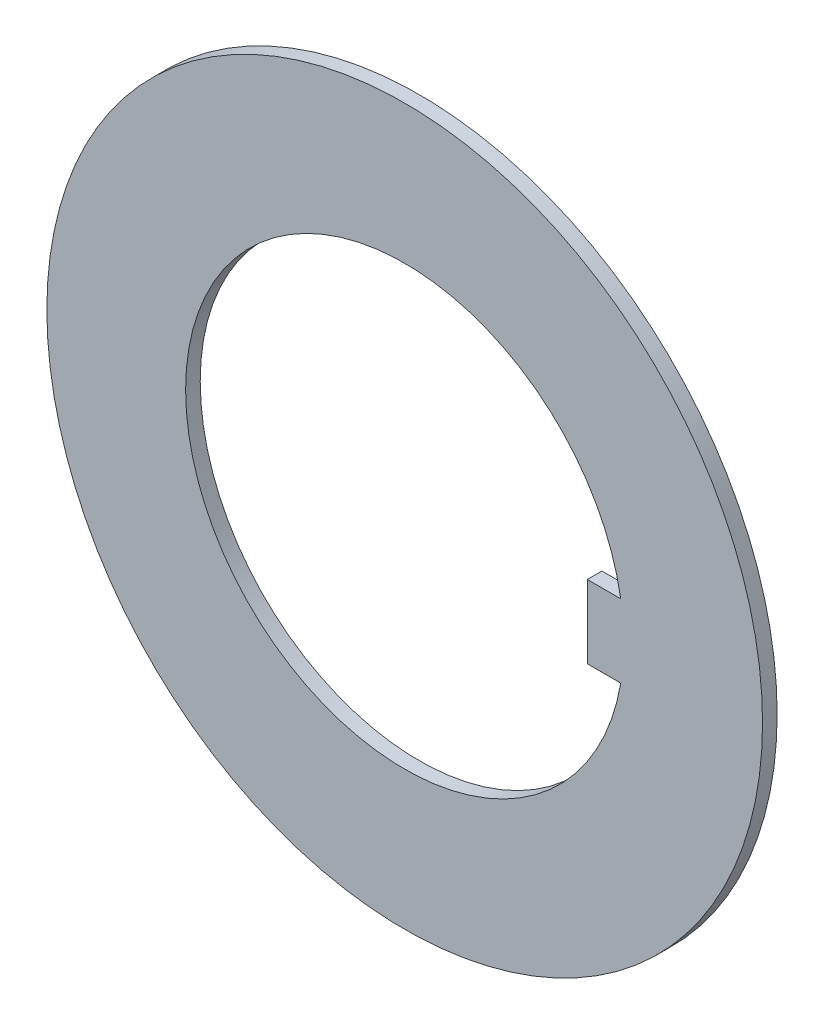
ISO-10303-21;
HEADER;
FILE_DESCRIPTION(('STEP AP214'),'2;1');
FILE_NAME('part.step','',(''),(''),'','','');
FILE_SCHEMA(('AUTOMOTIVE_DESIGN { 1 0 10303 214 1 1 1 1 }'));
ENDSEC;
DATA;
#1=APPLICATION_CONTEXT('core data for automotive mechanical design processes');
#2=APPLICATION_PROTOCOL_DEFINITION('international standard','automotive_design',2000,#1);
#3=PRODUCT_CONTEXT('',#1,'mechanical');
#4=PRODUCT('Part','Part','',(#3));
#5=PRODUCT_RELATED_PRODUCT_CATEGORY('part','',(#4));
#6=PRODUCT_DEFINITION_FORMATION('','',#4);
#7=PRODUCT_DEFINITION_CONTEXT('part definition',#1,'design');
#8=PRODUCT_DEFINITION('design','',#6,#7);
#9=PRODUCT_DEFINITION_SHAPE('','',#8);
#10=(LENGTH_UNIT() NAMED_UNIT(*) SI_UNIT(.MILLI.,.METRE.));
#11=(NAMED_UNIT(*) PLANE_ANGLE_UNIT() SI_UNIT($,.RADIAN.));
#12=(NAMED_UNIT(*) SI_UNIT($,.STERADIAN.) SOLID_ANGLE_UNIT());
#13=UNCERTAINTY_MEASURE_WITH_UNIT(LENGTH_MEASURE(1.E-05),#10,'distance_accuracy_value','');
#14=(GEOMETRIC_REPRESENTATION_CONTEXT(3) GLOBAL_UNCERTAINTY_ASSIGNED_CONTEXT((#13)) GLOBAL_UNIT_ASSIGNED_CONTEXT((#10,
#11,#12)) REPRESENTATION_CONTEXT('',''));
#15=CARTESIAN_POINT('',(0.,0.,0.));
#16=DIRECTION('',(0.,0.,1.));
#17=DIRECTION('',(1.,0.,0.));
#18=AXIS2_PLACEMENT_3D('',#15,#16,#17);
#19=CARTESIAN_POINT('',(0.,0.,150.));
#20=DIRECTION('',(0.,0.,1.));
#21=DIRECTION('',(1.,0.,0.));
#22=AXIS2_PLACEMENT_3D('',#19,#20,#21);
#23=CYLINDRICAL_SURFACE('',#22,15.);
#24=CARTESIAN_POINT('',(0.,0.,-89.));
#25=DIRECTION('',(0.,0.,1.));
#26=DIRECTION('',(1.,0.,0.));
#27=AXIS2_PLACEMENT_3D('',#24,#25,#26);
#28=CIRCLE('',#27,15.);
#29=CARTESIAN_POINT('',(14.790199457749,2.5,-89.));
#30=VERTEX_POINT('',#29);
#31=CARTESIAN_POINT('',(14.790199457749,-2.5,-89.));
#32=VERTEX_POINT('',#31);
#33=EDGE_CURVE('E117',#30,#32,#28,.T.);
#34=ORIENTED_EDGE('',*,*,#33,.F.);
#35=DIRECTION('',(0.,0.,1.));
#36=VECTOR('',#35,1.);
#37=CARTESIAN_POINT('',(14.790199457749,2.5,150.));
#38=LINE('',#37,#36);
#39=CARTESIAN_POINT('',(14.790199457749,2.5,-88.));
#40=VERTEX_POINT('',#39);
#41=EDGE_CURVE('E54',#30,#40,#38,.T.);
#42=ORIENTED_EDGE('',*,*,#41,.T.);
#43=CARTESIAN_POINT('',(0.,0.,-88.));
#44=DIRECTION('',(0.,0.,1.));
#45=DIRECTION('',(1.,0.,0.));
#46=AXIS2_PLACEMENT_3D('',#43,#44,#45);
#47=CIRCLE('',#46,15.);
#48=CARTESIAN_POINT('',(14.790199457749,-2.5,-88.));
#49=VERTEX_POINT('',#48);
#50=EDGE_CURVE('E11',#40,#49,#47,.T.);
#51=ORIENTED_EDGE('',*,*,#50,.T.);
#52=DIRECTION('',(0.,0.,1.));
#53=VECTOR('',#52,1.);
#54=CARTESIAN_POINT('',(14.790199457749,-2.5,150.));
#55=LINE('',#54,#53);
#56=EDGE_CURVE('E58',#32,#49,#55,.T.);
#57=ORIENTED_EDGE('',*,*,#56,.F.);
#58=EDGE_LOOP('',(#34,#42,#51,#57));
#59=FACE_BOUND('',#58,.T.);
#60=ADVANCED_FACE('F41',(#59),#23,.F.);
#61=CARTESIAN_POINT('',(15.,0.,-88.));
#62=DIRECTION('',(0.,0.,1.));
#63=DIRECTION('',(1.,0.,0.));
#64=AXIS2_PLACEMENT_3D('',#61,#62,#63);
#65=PLANE('',#64);
#66=ORIENTED_EDGE('',*,*,#50,.F.);
#67=DIRECTION('',(1.,0.,0.));
#68=VECTOR('',#67,1.);
#69=CARTESIAN_POINT('',(12.5,2.5,-88.));
#70=LINE('',#69,#68);
#71=CARTESIAN_POINT('',(12.5,2.5,-88.));
#72=VERTEX_POINT('',#71);
#73=EDGE_CURVE('E80',#72,#40,#70,.T.);
#74=ORIENTED_EDGE('',*,*,#73,.F.);
#75=DIRECTION('',(0.,-1.,0.));
#76=VECTOR('',#75,1.);
#77=CARTESIAN_POINT('',(12.5,2.5,-88.));
#78=LINE('',#77,#76);
#79=CARTESIAN_POINT('',(12.5,-2.5,-88.));
#80=VERTEX_POINT('',#79);
#81=EDGE_CURVE('E88',#72,#80,#78,.T.);
#82=ORIENTED_EDGE('',*,*,#81,.T.);
#83=DIRECTION('',(1.,0.,0.));
#84=VECTOR('',#83,1.);
#85=CARTESIAN_POINT('',(12.5,-2.5,-88.));
#86=LINE('',#85,#84);
#87=EDGE_CURVE('E154',#80,#49,#86,.T.);
#88=ORIENTED_EDGE('',*,*,#87,.T.);
#89=EDGE_LOOP('',(#66,#74,#82,#88));
#90=FACE_BOUND('',#89,.T.);
#91=CARTESIAN_POINT('',(0.,0.,-88.));
#92=DIRECTION('',(0.,0.,1.));
#93=DIRECTION('',(1.,0.,0.));
#94=AXIS2_PLACEMENT_3D('',#91,#92,#93);
#95=CIRCLE('',#94,24.5);
#96=CARTESIAN_POINT('',(24.5,0.,-88.));
#97=VERTEX_POINT('',#96);
#98=EDGE_CURVE('E47',#97,#97,#95,.T.);
#99=ORIENTED_EDGE('',*,*,#98,.T.);
#100=EDGE_LOOP('',(#99));
#101=FACE_BOUND('',#100,.T.);
#102=ADVANCED_FACE('F85',(#90,#101),#65,.T.);
#103=CARTESIAN_POINT('',(0.,0.,150.));
#104=DIRECTION('',(0.,0.,1.));
#105=DIRECTION('',(1.,0.,0.));
#106=AXIS2_PLACEMENT_3D('',#103,#104,#105);
#107=CYLINDRICAL_SURFACE('',#106,24.5);
#108=CARTESIAN_POINT('',(0.,0.,-89.));
#109=DIRECTION('',(0.,0.,1.));
#110=DIRECTION('',(1.,0.,0.));
#111=AXIS2_PLACEMENT_3D('',#108,#109,#110);
#112=CIRCLE('',#111,24.5);
#113=CARTESIAN_POINT('',(24.5,0.,-89.));
#114=VERTEX_POINT('',#113);
#115=EDGE_CURVE('E120',#114,#114,#112,.T.);
#116=ORIENTED_EDGE('',*,*,#115,.T.);
#117=EDGE_LOOP('',(#116));
#118=FACE_BOUND('',#117,.T.);
#119=ORIENTED_EDGE('',*,*,#98,.F.);
#120=EDGE_LOOP('',(#119));
#121=FACE_BOUND('',#120,.T.);
#122=ADVANCED_FACE('F126',(#118,#121),#107,.T.);
#123=CARTESIAN_POINT('',(24.5,0.,-89.));
#124=DIRECTION('',(0.,0.,-1.));
#125=DIRECTION('',(-1.,0.,0.));
#126=AXIS2_PLACEMENT_3D('',#123,#124,#125);
#127=PLANE('',#126);
#128=ORIENTED_EDGE('',*,*,#33,.T.);
#129=DIRECTION('',(-1.,0.,0.));
#130=VECTOR('',#129,1.);
#131=CARTESIAN_POINT('',(12.5,-2.5,-89.));
#132=LINE('',#131,#130);
#133=CARTESIAN_POINT('',(12.5,-2.5,-89.));
#134=VERTEX_POINT('',#133);
#135=EDGE_CURVE('E99',#32,#134,#132,.T.);
#136=ORIENTED_EDGE('',*,*,#135,.T.);
#137=DIRECTION('',(0.,-1.,0.));
#138=VECTOR('',#137,1.);
#139=CARTESIAN_POINT('',(12.5,2.5,-89.));
#140=LINE('',#139,#138);
#141=CARTESIAN_POINT('',(12.5,2.5,-89.));
#142=VERTEX_POINT('',#141);
#143=EDGE_CURVE('E106',#142,#134,#140,.T.);
#144=ORIENTED_EDGE('',*,*,#143,.F.);
#145=DIRECTION('',(-1.,0.,0.));
#146=VECTOR('',#145,1.);
#147=CARTESIAN_POINT('',(12.5,2.5,-89.));
#148=LINE('',#147,#146);
#149=EDGE_CURVE('E89',#30,#142,#148,.T.);
#150=ORIENTED_EDGE('',*,*,#149,.F.);
#151=EDGE_LOOP('',(#128,#136,#144,#150));
#152=FACE_BOUND('',#151,.T.);
#153=ORIENTED_EDGE('',*,*,#115,.F.);
#154=EDGE_LOOP('',(#153));
#155=FACE_BOUND('',#154,.T.);
#156=ADVANCED_FACE('F128',(#152,#155),#127,.T.);
#157=CARTESIAN_POINT('',(12.5,2.5,-88.));
#158=DIRECTION('',(1.,0.,0.));
#159=DIRECTION('',(0.,0.,-1.));
#160=AXIS2_PLACEMENT_3D('',#157,#158,#159);
#161=PLANE('',#160);
#162=DIRECTION('',(0.,0.,1.));
#163=VECTOR('',#162,1.);
#164=CARTESIAN_POINT('',(12.5,-2.5,-88.));
#165=LINE('',#164,#163);
#166=EDGE_CURVE('E102',#134,#80,#165,.T.);
#167=ORIENTED_EDGE('',*,*,#166,.T.);
#168=ORIENTED_EDGE('',*,*,#81,.F.);
#169=DIRECTION('',(0.,0.,1.));
#170=VECTOR('',#169,1.);
#171=CARTESIAN_POINT('',(12.5,2.5,-88.));
#172=LINE('',#171,#170);
#173=EDGE_CURVE('E93',#142,#72,#172,.T.);
#174=ORIENTED_EDGE('',*,*,#173,.F.);
#175=ORIENTED_EDGE('',*,*,#143,.T.);
#176=EDGE_LOOP('',(#167,#168,#174,#175));
#177=FACE_BOUND('',#176,.T.);
#178=ADVANCED_FACE('F105',(#177),#161,.F.);
#179=CARTESIAN_POINT('',(0.,2.5,0.));
#180=DIRECTION('',(0.,-1.,0.));
#181=DIRECTION('',(0.,0.,-1.));
#182=AXIS2_PLACEMENT_3D('',#179,#180,#181);
#183=PLANE('',#182);
#184=ORIENTED_EDGE('',*,*,#41,.F.);
#185=ORIENTED_EDGE('',*,*,#149,.T.);
#186=ORIENTED_EDGE('',*,*,#173,.T.);
#187=ORIENTED_EDGE('',*,*,#73,.T.);
#188=EDGE_LOOP('',(#184,#185,#186,#187));
#189=FACE_BOUND('',#188,.T.);
#190=ADVANCED_FACE('F94',(#189),#183,.F.);
#191=CARTESIAN_POINT('',(0.,-2.5,0.));
#192=DIRECTION('',(0.,-1.,0.));
#193=DIRECTION('',(0.,0.,-1.));
#194=AXIS2_PLACEMENT_3D('',#191,#192,#193);
#195=PLANE('',#194);
#196=ORIENTED_EDGE('',*,*,#135,.F.);
#197=ORIENTED_EDGE('',*,*,#56,.T.);
#198=ORIENTED_EDGE('',*,*,#87,.F.);
#199=ORIENTED_EDGE('',*,*,#166,.F.);
#200=EDGE_LOOP('',(#196,#197,#198,#199));
#201=FACE_BOUND('',#200,.T.);
#202=ADVANCED_FACE('F159',(#201),#195,.T.);
#203=CLOSED_SHELL('',(#60,#102,#122,#156,#178,#190,#202));
#204=MANIFOLD_SOLID_BREP('B2',#203);
#205=ADVANCED_BREP_SHAPE_REPRESENTATION('',(#18,#204),#14);
#206=SHAPE_DEFINITION_REPRESENTATION(#9,#205);
ENDSEC;
END-ISO-10303-21;
